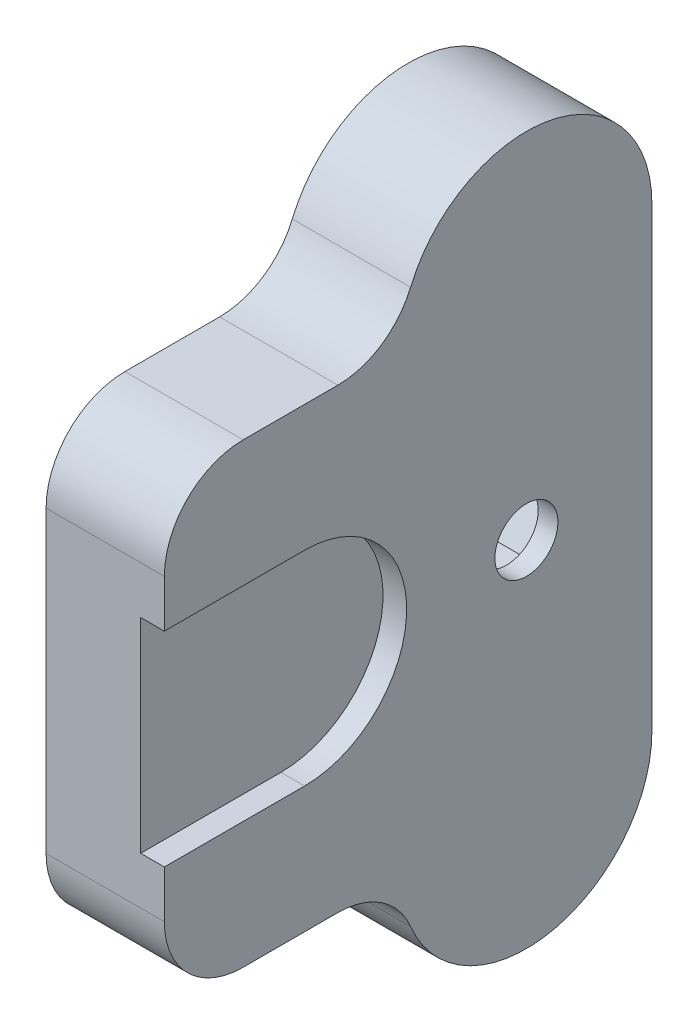
ISO-10303-21;
HEADER;
FILE_DESCRIPTION(('STEP AP214'),'2;1');
FILE_NAME('part.step','',(''),(''),'','','');
FILE_SCHEMA(('AUTOMOTIVE_DESIGN { 1 0 10303 214 1 1 1 1 }'));
ENDSEC;
DATA;
#1=APPLICATION_CONTEXT('core data for automotive mechanical design processes');
#2=APPLICATION_PROTOCOL_DEFINITION('international standard','automotive_design',2000,#1);
#3=PRODUCT_CONTEXT('',#1,'mechanical');
#4=PRODUCT('Part','Part','',(#3));
#5=PRODUCT_RELATED_PRODUCT_CATEGORY('part','',(#4));
#6=PRODUCT_DEFINITION_FORMATION('','',#4);
#7=PRODUCT_DEFINITION_CONTEXT('part definition',#1,'design');
#8=PRODUCT_DEFINITION('design','',#6,#7);
#9=PRODUCT_DEFINITION_SHAPE('','',#8);
#10=(LENGTH_UNIT() NAMED_UNIT(*) SI_UNIT(.MILLI.,.METRE.));
#11=(NAMED_UNIT(*) PLANE_ANGLE_UNIT() SI_UNIT($,.RADIAN.));
#12=(NAMED_UNIT(*) SI_UNIT($,.STERADIAN.) SOLID_ANGLE_UNIT());
#13=UNCERTAINTY_MEASURE_WITH_UNIT(LENGTH_MEASURE(1.E-05),#10,'distance_accuracy_value','');
#14=(GEOMETRIC_REPRESENTATION_CONTEXT(3) GLOBAL_UNCERTAINTY_ASSIGNED_CONTEXT((#13)) GLOBAL_UNIT_ASSIGNED_CONTEXT((#10,
#11,#12)) REPRESENTATION_CONTEXT('',''));
#15=CARTESIAN_POINT('',(0.,0.,0.));
#16=DIRECTION('',(0.,0.,1.));
#17=DIRECTION('',(1.,0.,0.));
#18=AXIS2_PLACEMENT_3D('',#15,#16,#17);
#19=CARTESIAN_POINT('',(15.,-28.9686177509747,3.13232637331732));
#20=DIRECTION('',(-1.,0.,0.));
#21=DIRECTION('',(0.,0.,1.));
#22=AXIS2_PLACEMENT_3D('',#19,#20,#21);
#23=CYLINDRICAL_SURFACE('',#22,15.921660548038);
#24=CARTESIAN_POINT('',(0.,-28.9686177509747,3.13232637331732));
#25=DIRECTION('',(1.,0.,0.));
#26=DIRECTION('',(0.,0.,-1.));
#27=AXIS2_PLACEMENT_3D('',#24,#25,#26);
#28=CIRCLE('',#27,15.921660548038);
#29=CARTESIAN_POINT('',(0.,-35.1108402056403,17.821518928538));
#30=VERTEX_POINT('',#29);
#31=CARTESIAN_POINT('',(0.,-28.9686177509747,-12.7893341747207));
#32=VERTEX_POINT('',#31);
#33=EDGE_CURVE('E254',#30,#32,#28,.T.);
#34=ORIENTED_EDGE('',*,*,#33,.T.);
#35=DIRECTION('',(-1.,0.,0.));
#36=VECTOR('',#35,1.);
#37=CARTESIAN_POINT('',(15.,-28.9686177509747,-12.7893341747207));
#38=LINE('',#37,#36);
#39=CARTESIAN_POINT('',(15.,-28.9686177509747,-12.7893341747207));
#40=VERTEX_POINT('',#39);
#41=EDGE_CURVE('E326',#40,#32,#38,.T.);
#42=ORIENTED_EDGE('',*,*,#41,.F.);
#43=CARTESIAN_POINT('',(15.,-28.9686177509747,3.13232637331732));
#44=DIRECTION('',(1.,0.,0.));
#45=DIRECTION('',(0.,0.,-1.));
#46=AXIS2_PLACEMENT_3D('',#43,#44,#45);
#47=CIRCLE('',#46,15.921660548038);
#48=CARTESIAN_POINT('',(15.,-35.1108402056403,17.821518928538));
#49=VERTEX_POINT('',#48);
#50=EDGE_CURVE('E258',#49,#40,#47,.T.);
#51=ORIENTED_EDGE('',*,*,#50,.F.);
#52=DIRECTION('',(-1.,0.,0.));
#53=VECTOR('',#52,1.);
#54=CARTESIAN_POINT('',(15.,-35.1108402056403,17.821518928538));
#55=LINE('',#54,#53);
#56=EDGE_CURVE('E278',#49,#30,#55,.T.);
#57=ORIENTED_EDGE('',*,*,#56,.T.);
#58=EDGE_LOOP('',(#34,#42,#51,#57));
#59=FACE_BOUND('',#58,.T.);
#60=ADVANCED_FACE('F46',(#59),#23,.T.);
#61=CARTESIAN_POINT('',(15.,-28.9686177509747,-12.7893341747207));
#62=DIRECTION('',(0.,0.,1.));
#63=DIRECTION('',(1.,0.,0.));
#64=AXIS2_PLACEMENT_3D('',#61,#62,#63);
#65=PLANE('',#64);
#66=DIRECTION('',(0.,1.,0.));
#67=VECTOR('',#66,1.);
#68=CARTESIAN_POINT('',(0.,-28.9686177509747,-12.7893341747207));
#69=LINE('',#68,#67);
#70=CARTESIAN_POINT('',(0.,28.9686177509747,-12.7893341747207));
#71=VERTEX_POINT('',#70);
#72=EDGE_CURVE('E284',#32,#71,#69,.T.);
#73=ORIENTED_EDGE('',*,*,#72,.T.);
#74=DIRECTION('',(-1.,0.,0.));
#75=VECTOR('',#74,1.);
#76=CARTESIAN_POINT('',(15.,28.9686177509747,-12.7893341747207));
#77=LINE('',#76,#75);
#78=CARTESIAN_POINT('',(15.,28.9686177509747,-12.7893341747207));
#79=VERTEX_POINT('',#78);
#80=EDGE_CURVE('E323',#79,#71,#77,.T.);
#81=ORIENTED_EDGE('',*,*,#80,.F.);
#82=DIRECTION('',(0.,1.,0.));
#83=VECTOR('',#82,1.);
#84=CARTESIAN_POINT('',(15.,-28.9686177509747,-12.7893341747207));
#85=LINE('',#84,#83);
#86=EDGE_CURVE('E259',#40,#79,#85,.T.);
#87=ORIENTED_EDGE('',*,*,#86,.F.);
#88=ORIENTED_EDGE('',*,*,#41,.T.);
#89=EDGE_LOOP('',(#73,#81,#87,#88));
#90=FACE_BOUND('',#89,.T.);
#91=ADVANCED_FACE('F364',(#90),#65,.F.);
#92=CARTESIAN_POINT('',(15.,28.9686177509747,3.13232637331732));
#93=DIRECTION('',(-1.,0.,0.));
#94=DIRECTION('',(0.,0.,1.));
#95=AXIS2_PLACEMENT_3D('',#92,#93,#94);
#96=CYLINDRICAL_SURFACE('',#95,15.921660548038);
#97=CARTESIAN_POINT('',(0.,28.9686177509747,3.13232637331732));
#98=DIRECTION('',(1.,0.,0.));
#99=DIRECTION('',(0.,0.,1.));
#100=AXIS2_PLACEMENT_3D('',#97,#98,#99);
#101=CIRCLE('',#100,15.921660548038);
#102=CARTESIAN_POINT('',(0.,35.1108402056403,17.821518928538));
#103=VERTEX_POINT('',#102);
#104=EDGE_CURVE('E285',#71,#103,#101,.T.);
#105=ORIENTED_EDGE('',*,*,#104,.T.);
#106=DIRECTION('',(-1.,0.,0.));
#107=VECTOR('',#106,1.);
#108=CARTESIAN_POINT('',(15.,35.1108402056403,17.821518928538));
#109=LINE('',#108,#107);
#110=CARTESIAN_POINT('',(15.,35.1108402056403,17.821518928538));
#111=VERTEX_POINT('',#110);
#112=EDGE_CURVE('E319',#111,#103,#109,.T.);
#113=ORIENTED_EDGE('',*,*,#112,.F.);
#114=CARTESIAN_POINT('',(15.,28.9686177509747,3.13232637331732));
#115=DIRECTION('',(1.,0.,0.));
#116=DIRECTION('',(0.,0.,1.));
#117=AXIS2_PLACEMENT_3D('',#114,#115,#116);
#118=CIRCLE('',#117,15.921660548038);
#119=EDGE_CURVE('E265',#79,#111,#118,.T.);
#120=ORIENTED_EDGE('',*,*,#119,.F.);
#121=ORIENTED_EDGE('',*,*,#80,.T.);
#122=EDGE_LOOP('',(#105,#113,#120,#121));
#123=FACE_BOUND('',#122,.T.);
#124=ADVANCED_FACE('F367',(#123),#96,.T.);
#125=CARTESIAN_POINT('',(15.,38.9686177509747,27.0474363577541));
#126=DIRECTION('',(-1.,0.,0.));
#127=DIRECTION('',(0.,0.,1.));
#128=AXIS2_PLACEMENT_3D('',#125,#126,#127);
#129=CYLINDRICAL_SURFACE('',#128,9.99999999999999);
#130=CARTESIAN_POINT('',(0.,38.9686177509747,27.0474363577541));
#131=DIRECTION('',(-1.,0.,0.));
#132=DIRECTION('',(0.,0.,1.));
#133=AXIS2_PLACEMENT_3D('',#130,#131,#132);
#134=CIRCLE('',#133,9.99999999999999);
#135=CARTESIAN_POINT('',(0.,28.9686177509747,27.0474363577541));
#136=VERTEX_POINT('',#135);
#137=EDGE_CURVE('E290',#103,#136,#134,.T.);
#138=ORIENTED_EDGE('',*,*,#137,.T.);
#139=DIRECTION('',(-1.,0.,0.));
#140=VECTOR('',#139,1.);
#141=CARTESIAN_POINT('',(15.,28.9686177509747,27.0474363577541));
#142=LINE('',#141,#140);
#143=CARTESIAN_POINT('',(15.,28.9686177509747,27.0474363577541));
#144=VERTEX_POINT('',#143);
#145=EDGE_CURVE('E320',#144,#136,#142,.T.);
#146=ORIENTED_EDGE('',*,*,#145,.F.);
#147=CARTESIAN_POINT('',(15.,38.9686177509747,27.0474363577541));
#148=DIRECTION('',(-1.,0.,0.));
#149=DIRECTION('',(0.,0.,1.));
#150=AXIS2_PLACEMENT_3D('',#147,#148,#149);
#151=CIRCLE('',#150,9.99999999999999);
#152=EDGE_CURVE('E262',#111,#144,#151,.T.);
#153=ORIENTED_EDGE('',*,*,#152,.F.);
#154=ORIENTED_EDGE('',*,*,#112,.T.);
#155=EDGE_LOOP('',(#138,#146,#153,#154));
#156=FACE_BOUND('',#155,.T.);
#157=ADVANCED_FACE('F416',(#156),#129,.F.);
#158=CARTESIAN_POINT('',(15.,28.9686177509747,39.0539869213552));
#159=DIRECTION('',(0.,-1.,0.));
#160=DIRECTION('',(0.,0.,-1.));
#161=AXIS2_PLACEMENT_3D('',#158,#159,#160);
#162=PLANE('',#161);
#163=DIRECTION('',(0.,0.,1.));
#164=VECTOR('',#163,1.);
#165=CARTESIAN_POINT('',(0.,28.9686177509747,39.0539869213552));
#166=LINE('',#165,#164);
#167=CARTESIAN_POINT('',(0.,28.9686177509747,39.0539869213552));
#168=VERTEX_POINT('',#167);
#169=EDGE_CURVE('E287',#136,#168,#166,.T.);
#170=ORIENTED_EDGE('',*,*,#169,.T.);
#171=DIRECTION('',(-1.,0.,0.));
#172=VECTOR('',#171,1.);
#173=CARTESIAN_POINT('',(15.,28.9686177509747,39.0539869213552));
#174=LINE('',#173,#172);
#175=CARTESIAN_POINT('',(15.,28.9686177509747,39.0539869213552));
#176=VERTEX_POINT('',#175);
#177=EDGE_CURVE('E314',#176,#168,#174,.T.);
#178=ORIENTED_EDGE('',*,*,#177,.F.);
#179=DIRECTION('',(0.,0.,1.));
#180=VECTOR('',#179,1.);
#181=CARTESIAN_POINT('',(15.,28.9686177509747,39.0539869213552));
#182=LINE('',#181,#180);
#183=EDGE_CURVE('E266',#144,#176,#182,.T.);
#184=ORIENTED_EDGE('',*,*,#183,.F.);
#185=ORIENTED_EDGE('',*,*,#145,.T.);
#186=EDGE_LOOP('',(#170,#178,#184,#185));
#187=FACE_BOUND('',#186,.T.);
#188=ADVANCED_FACE('F413',(#187),#162,.F.);
#189=CARTESIAN_POINT('',(15.,18.9686177509747,39.0539869213552));
#190=DIRECTION('',(-1.,0.,0.));
#191=DIRECTION('',(0.,0.,1.));
#192=AXIS2_PLACEMENT_3D('',#189,#190,#191);
#193=CYLINDRICAL_SURFACE('',#192,10.);
#194=CARTESIAN_POINT('',(0.,18.9686177509747,39.0539869213552));
#195=DIRECTION('',(1.,0.,0.));
#196=DIRECTION('',(0.,0.,1.));
#197=AXIS2_PLACEMENT_3D('',#194,#195,#196);
#198=CIRCLE('',#197,10.);
#199=CARTESIAN_POINT('',(0.,18.9686177509747,49.0539869213552));
#200=VERTEX_POINT('',#199);
#201=EDGE_CURVE('E292',#168,#200,#198,.T.);
#202=ORIENTED_EDGE('',*,*,#201,.T.);
#203=DIRECTION('',(-1.,0.,0.));
#204=VECTOR('',#203,1.);
#205=CARTESIAN_POINT('',(15.,18.9686177509747,49.0539869213552));
#206=LINE('',#205,#204);
#207=CARTESIAN_POINT('',(15.,18.9686177509747,49.0539869213552));
#208=VERTEX_POINT('',#207);
#209=EDGE_CURVE('E313',#208,#200,#206,.T.);
#210=ORIENTED_EDGE('',*,*,#209,.F.);
#211=CARTESIAN_POINT('',(15.,18.9686177509747,39.0539869213552));
#212=DIRECTION('',(1.,0.,0.));
#213=DIRECTION('',(0.,0.,1.));
#214=AXIS2_PLACEMENT_3D('',#211,#212,#213);
#215=CIRCLE('',#214,10.);
#216=EDGE_CURVE('E268',#176,#208,#215,.T.);
#217=ORIENTED_EDGE('',*,*,#216,.F.);
#218=ORIENTED_EDGE('',*,*,#177,.T.);
#219=EDGE_LOOP('',(#202,#210,#217,#218));
#220=FACE_BOUND('',#219,.T.);
#221=ADVANCED_FACE('F410',(#220),#193,.T.);
#222=CARTESIAN_POINT('',(15.,18.9686177509747,49.0539869213552));
#223=DIRECTION('',(0.,0.,-1.));
#224=DIRECTION('',(0.,1.,0.));
#225=AXIS2_PLACEMENT_3D('',#222,#223,#224);
#226=PLANE('',#225);
#227=DIRECTION('',(0.,-1.,0.));
#228=VECTOR('',#227,1.);
#229=CARTESIAN_POINT('',(12.,-12.95,49.0539869213552));
#230=LINE('',#229,#228);
#231=CARTESIAN_POINT('',(12.,12.95,49.0539869213552));
#232=VERTEX_POINT('',#231);
#233=CARTESIAN_POINT('',(12.,-12.95,49.0539869213552));
#234=VERTEX_POINT('',#233);
#235=EDGE_CURVE('E223',#232,#234,#230,.T.);
#236=ORIENTED_EDGE('',*,*,#235,.F.);
#237=DIRECTION('',(1.,0.,0.));
#238=VECTOR('',#237,1.);
#239=CARTESIAN_POINT('',(12.,12.95,49.0539869213552));
#240=LINE('',#239,#238);
#241=CARTESIAN_POINT('',(15.,12.95,49.0539869213552));
#242=VERTEX_POINT('',#241);
#243=EDGE_CURVE('E245',#232,#242,#240,.T.);
#244=ORIENTED_EDGE('',*,*,#243,.T.);
#245=DIRECTION('',(0.,-1.,0.));
#246=VECTOR('',#245,1.);
#247=CARTESIAN_POINT('',(15.,18.9686177509747,49.0539869213552));
#248=LINE('',#247,#246);
#249=EDGE_CURVE('E271',#208,#242,#248,.T.);
#250=ORIENTED_EDGE('',*,*,#249,.F.);
#251=ORIENTED_EDGE('',*,*,#209,.T.);
#252=DIRECTION('',(0.,-1.,0.));
#253=VECTOR('',#252,1.);
#254=CARTESIAN_POINT('',(0.,18.9686177509747,49.0539869213552));
#255=LINE('',#254,#253);
#256=CARTESIAN_POINT('',(0.,-18.9686177509747,49.0539869213552));
#257=VERTEX_POINT('',#256);
#258=EDGE_CURVE('E291',#200,#257,#255,.T.);
#259=ORIENTED_EDGE('',*,*,#258,.T.);
#260=DIRECTION('',(-1.,0.,0.));
#261=VECTOR('',#260,1.);
#262=CARTESIAN_POINT('',(15.,-18.9686177509747,49.0539869213552));
#263=LINE('',#262,#261);
#264=CARTESIAN_POINT('',(15.,-18.9686177509747,49.0539869213552));
#265=VERTEX_POINT('',#264);
#266=EDGE_CURVE('E306',#265,#257,#263,.T.);
#267=ORIENTED_EDGE('',*,*,#266,.F.);
#268=CARTESIAN_POINT('',(15.,-12.95,49.0539869213552));
#269=VERTEX_POINT('',#268);
#270=EDGE_CURVE('E269',#269,#265,#248,.T.);
#271=ORIENTED_EDGE('',*,*,#270,.F.);
#272=DIRECTION('',(1.,0.,0.));
#273=VECTOR('',#272,1.);
#274=CARTESIAN_POINT('',(12.,-12.95,49.0539869213552));
#275=LINE('',#274,#273);
#276=EDGE_CURVE('E68',#234,#269,#275,.T.);
#277=ORIENTED_EDGE('',*,*,#276,.F.);
#278=EDGE_LOOP('',(#236,#244,#250,#251,#259,#267,#271,#277));
#279=FACE_BOUND('',#278,.T.);
#280=ADVANCED_FACE('F404',(#279),#226,.F.);
#281=CARTESIAN_POINT('',(15.,-18.9686177509747,39.0539869213552));
#282=DIRECTION('',(-1.,0.,0.));
#283=DIRECTION('',(0.,0.,1.));
#284=AXIS2_PLACEMENT_3D('',#281,#282,#283);
#285=CYLINDRICAL_SURFACE('',#284,10.);
#286=CARTESIAN_POINT('',(0.,-18.9686177509747,39.0539869213552));
#287=DIRECTION('',(1.,0.,0.));
#288=DIRECTION('',(0.,0.,-1.));
#289=AXIS2_PLACEMENT_3D('',#286,#287,#288);
#290=CIRCLE('',#289,10.);
#291=CARTESIAN_POINT('',(0.,-28.9686177509747,39.0539869213552));
#292=VERTEX_POINT('',#291);
#293=EDGE_CURVE('E293',#257,#292,#290,.T.);
#294=ORIENTED_EDGE('',*,*,#293,.T.);
#295=DIRECTION('',(-1.,0.,0.));
#296=VECTOR('',#295,1.);
#297=CARTESIAN_POINT('',(15.,-28.9686177509747,39.0539869213552));
#298=LINE('',#297,#296);
#299=CARTESIAN_POINT('',(15.,-28.9686177509747,39.0539869213552));
#300=VERTEX_POINT('',#299);
#301=EDGE_CURVE('E301',#300,#292,#298,.T.);
#302=ORIENTED_EDGE('',*,*,#301,.F.);
#303=CARTESIAN_POINT('',(15.,-18.9686177509747,39.0539869213552));
#304=DIRECTION('',(1.,0.,0.));
#305=DIRECTION('',(0.,0.,-1.));
#306=AXIS2_PLACEMENT_3D('',#303,#304,#305);
#307=CIRCLE('',#306,10.);
#308=EDGE_CURVE('E273',#265,#300,#307,.T.);
#309=ORIENTED_EDGE('',*,*,#308,.F.);
#310=ORIENTED_EDGE('',*,*,#266,.T.);
#311=EDGE_LOOP('',(#294,#302,#309,#310));
#312=FACE_BOUND('',#311,.T.);
#313=ADVANCED_FACE('F398',(#312),#285,.T.);
#314=CARTESIAN_POINT('',(15.,-28.9686177509747,39.0539869213552));
#315=DIRECTION('',(0.,1.,0.));
#316=DIRECTION('',(0.,0.,1.));
#317=AXIS2_PLACEMENT_3D('',#314,#315,#316);
#318=PLANE('',#317);
#319=DIRECTION('',(0.,0.,-1.));
#320=VECTOR('',#319,1.);
#321=CARTESIAN_POINT('',(0.,-28.9686177509747,39.0539869213552));
#322=LINE('',#321,#320);
#323=CARTESIAN_POINT('',(0.,-28.9686177509747,27.0474363577541));
#324=VERTEX_POINT('',#323);
#325=EDGE_CURVE('E299',#292,#324,#322,.T.);
#326=ORIENTED_EDGE('',*,*,#325,.T.);
#327=DIRECTION('',(-1.,0.,0.));
#328=VECTOR('',#327,1.);
#329=CARTESIAN_POINT('',(15.,-28.9686177509747,27.0474363577541));
#330=LINE('',#329,#328);
#331=CARTESIAN_POINT('',(15.,-28.9686177509747,27.0474363577541));
#332=VERTEX_POINT('',#331);
#333=EDGE_CURVE('E305',#332,#324,#330,.T.);
#334=ORIENTED_EDGE('',*,*,#333,.F.);
#335=DIRECTION('',(0.,0.,-1.));
#336=VECTOR('',#335,1.);
#337=CARTESIAN_POINT('',(15.,-28.9686177509747,39.0539869213552));
#338=LINE('',#337,#336);
#339=EDGE_CURVE('E277',#300,#332,#338,.T.);
#340=ORIENTED_EDGE('',*,*,#339,.F.);
#341=ORIENTED_EDGE('',*,*,#301,.T.);
#342=EDGE_LOOP('',(#326,#334,#340,#341));
#343=FACE_BOUND('',#342,.T.);
#344=ADVANCED_FACE('F392',(#343),#318,.F.);
#345=CARTESIAN_POINT('',(15.,-38.9686177509747,27.0474363577541));
#346=DIRECTION('',(-1.,0.,0.));
#347=DIRECTION('',(0.,0.,1.));
#348=AXIS2_PLACEMENT_3D('',#345,#346,#347);
#349=CYLINDRICAL_SURFACE('',#348,9.99999999999999);
#350=CARTESIAN_POINT('',(0.,-38.9686177509747,27.0474363577541));
#351=DIRECTION('',(-1.,0.,0.));
#352=DIRECTION('',(0.,0.,-1.));
#353=AXIS2_PLACEMENT_3D('',#350,#351,#352);
#354=CIRCLE('',#353,9.99999999999999);
#355=EDGE_CURVE('E257',#324,#30,#354,.T.);
#356=ORIENTED_EDGE('',*,*,#355,.T.);
#357=ORIENTED_EDGE('',*,*,#56,.F.);
#358=CARTESIAN_POINT('',(15.,-38.9686177509747,27.0474363577541));
#359=DIRECTION('',(-1.,0.,0.));
#360=DIRECTION('',(0.,0.,-1.));
#361=AXIS2_PLACEMENT_3D('',#358,#359,#360);
#362=CIRCLE('',#361,9.99999999999999);
#363=EDGE_CURVE('E279',#332,#49,#362,.T.);
#364=ORIENTED_EDGE('',*,*,#363,.F.);
#365=ORIENTED_EDGE('',*,*,#333,.T.);
#366=EDGE_LOOP('',(#356,#357,#364,#365));
#367=FACE_BOUND('',#366,.T.);
#368=ADVANCED_FACE('F388',(#367),#349,.F.);
#369=CARTESIAN_POINT('',(15.,-28.9686177509747,3.13232637331732));
#370=DIRECTION('',(1.,0.,0.));
#371=DIRECTION('',(0.,0.,-1.));
#372=AXIS2_PLACEMENT_3D('',#369,#370,#371);
#373=PLANE('',#372);
#374=DIRECTION('',(0.,0.,1.));
#375=VECTOR('',#374,1.);
#376=CARTESIAN_POINT('',(15.,12.95,31.2677038838304));
#377=LINE('',#376,#375);
#378=CARTESIAN_POINT('',(15.,12.95,31.2677038838304));
#379=VERTEX_POINT('',#378);
#380=EDGE_CURVE('E228',#379,#242,#377,.T.);
#381=ORIENTED_EDGE('',*,*,#380,.F.);
#382=CARTESIAN_POINT('',(15.,0.,31.2677038838304));
#383=DIRECTION('',(1.,0.,0.));
#384=DIRECTION('',(0.,0.,-1.));
#385=AXIS2_PLACEMENT_3D('',#382,#383,#384);
#386=CIRCLE('',#385,12.95);
#387=CARTESIAN_POINT('',(15.,-12.95,31.2677038838304));
#388=VERTEX_POINT('',#387);
#389=EDGE_CURVE('E238',#388,#379,#386,.T.);
#390=ORIENTED_EDGE('',*,*,#389,.F.);
#391=DIRECTION('',(0.,0.,-1.));
#392=VECTOR('',#391,1.);
#393=CARTESIAN_POINT('',(15.,-12.95,49.0539869213552));
#394=LINE('',#393,#392);
#395=EDGE_CURVE('E236',#269,#388,#394,.T.);
#396=ORIENTED_EDGE('',*,*,#395,.F.);
#397=ORIENTED_EDGE('',*,*,#270,.T.);
#398=ORIENTED_EDGE('',*,*,#308,.T.);
#399=ORIENTED_EDGE('',*,*,#339,.T.);
#400=ORIENTED_EDGE('',*,*,#363,.T.);
#401=ORIENTED_EDGE('',*,*,#50,.T.);
#402=ORIENTED_EDGE('',*,*,#86,.T.);
#403=ORIENTED_EDGE('',*,*,#119,.T.);
#404=ORIENTED_EDGE('',*,*,#152,.T.);
#405=ORIENTED_EDGE('',*,*,#183,.T.);
#406=ORIENTED_EDGE('',*,*,#216,.T.);
#407=ORIENTED_EDGE('',*,*,#249,.T.);
#408=EDGE_LOOP('',(#381,#390,#396,#397,#398,#399,#400,#401,#402,#403,#404,#405,#406,#407));
#409=FACE_BOUND('',#408,.T.);
#410=CARTESIAN_POINT('',(15.,0.,3.13232637331727));
#411=DIRECTION('',(1.,0.,0.));
#412=DIRECTION('',(0.,0.,-1.));
#413=AXIS2_PLACEMENT_3D('',#410,#411,#412);
#414=CIRCLE('',#413,4.);
#415=CARTESIAN_POINT('',(15.,0.,-0.867673626682733));
#416=VERTEX_POINT('',#415);
#417=EDGE_CURVE('E250',#416,#416,#414,.T.);
#418=ORIENTED_EDGE('',*,*,#417,.F.);
#419=EDGE_LOOP('',(#418));
#420=FACE_BOUND('',#419,.T.);
#421=ADVANCED_FACE('F383',(#409,#420),#373,.T.);
#422=CARTESIAN_POINT('',(0.,-28.9686177509747,3.13232637331732));
#423=DIRECTION('',(1.,0.,0.));
#424=DIRECTION('',(0.,0.,-1.));
#425=AXIS2_PLACEMENT_3D('',#422,#423,#424);
#426=PLANE('',#425);
#427=DIRECTION('',(0.,0.845327020739453,0.534249219005289));
#428=VECTOR('',#427,1.);
#429=CARTESIAN_POINT('',(0.,-17.7085347037566,-14.684175957385));
#430=LINE('',#429,#428);
#431=CARTESIAN_POINT('',(0.,0.258716841757371,-3.32881895310315));
#432=VERTEX_POINT('',#431);
#433=CARTESIAN_POINT('',(0.,5.72487441110187,0.125809067455821));
#434=VERTEX_POINT('',#433);
#435=EDGE_CURVE('E52',#432,#434,#430,.T.);
#436=ORIENTED_EDGE('',*,*,#435,.T.);
#437=DIRECTION('',(0.,-0.040009885240851,0.999199283968426));
#438=VECTOR('',#437,1.);
#439=CARTESIAN_POINT('',(0.,5.54914329004977,4.51448474770838));
#440=LINE('',#439,#438);
#441=CARTESIAN_POINT('',(0.,5.4661575693445,6.58695439387624));
#442=VERTEX_POINT('',#441);
#443=EDGE_CURVE('E11',#434,#442,#440,.T.);
#444=ORIENTED_EDGE('',*,*,#443,.T.);
#445=DIRECTION('',(0.,-0.885336905980303,0.464950064963136));
#446=VECTOR('',#445,1.);
#447=CARTESIAN_POINT('',(0.,-20.1025032323088,20.014781044326));
#448=LINE('',#447,#446);
#449=CARTESIAN_POINT('',(0.,-0.258716841757364,9.59347169973769));
#450=VERTEX_POINT('',#449);
#451=EDGE_CURVE('E188',#442,#450,#448,.T.);
#452=ORIENTED_EDGE('',*,*,#451,.T.);
#453=DIRECTION('',(0.,-0.845327020739452,-0.53424921900529));
#454=VECTOR('',#453,1.);
#455=CARTESIAN_POINT('',(0.,-23.6921259566159,-5.21651332510313));
#456=LINE('',#455,#454);
#457=CARTESIAN_POINT('',(0.,-5.72487441110187,6.13884367917871));
#458=VERTEX_POINT('',#457);
#459=EDGE_CURVE('E335',#450,#458,#456,.T.);
#460=ORIENTED_EDGE('',*,*,#459,.T.);
#461=DIRECTION('',(0.,0.0400098852408509,-0.999199283968426));
#462=VECTOR('',#461,1.);
#463=CARTESIAN_POINT('',(0.,-5.64188869039658,4.06637403301085));
#464=LINE('',#463,#462);
#465=CARTESIAN_POINT('',(0.,-5.46615756934448,-0.322301647241716));
#466=VERTEX_POINT('',#465);
#467=EDGE_CURVE('E333',#458,#466,#464,.T.);
#468=ORIENTED_EDGE('',*,*,#467,.T.);
#469=DIRECTION('',(0.,0.885336905980303,-0.464950064963136));
#470=VECTOR('',#469,1.);
#471=CARTESIAN_POINT('',(0.,-25.3099439598959,10.0990076973466));
#472=LINE('',#471,#470);
#473=EDGE_CURVE('E339',#466,#432,#472,.T.);
#474=ORIENTED_EDGE('',*,*,#473,.T.);
#475=EDGE_LOOP('',(#436,#444,#452,#460,#468,#474));
#476=FACE_BOUND('',#475,.T.);
#477=ORIENTED_EDGE('',*,*,#33,.F.);
#478=ORIENTED_EDGE('',*,*,#355,.F.);
#479=ORIENTED_EDGE('',*,*,#325,.F.);
#480=ORIENTED_EDGE('',*,*,#293,.F.);
#481=ORIENTED_EDGE('',*,*,#258,.F.);
#482=ORIENTED_EDGE('',*,*,#201,.F.);
#483=ORIENTED_EDGE('',*,*,#169,.F.);
#484=ORIENTED_EDGE('',*,*,#137,.F.);
#485=ORIENTED_EDGE('',*,*,#104,.F.);
#486=ORIENTED_EDGE('',*,*,#72,.F.);
#487=EDGE_LOOP('',(#477,#478,#479,#480,#481,#482,#483,#484,#485,#486));
#488=FACE_BOUND('',#487,.T.);
#489=ADVANCED_FACE('F345',(#476,#488),#426,.F.);
#490=CARTESIAN_POINT('',(0.953799999999999,0.,3.13232637331727));
#491=DIRECTION('',(1.,0.,0.));
#492=DIRECTION('',(0.,0.,-1.));
#493=AXIS2_PLACEMENT_3D('',#490,#491,#492);
#494=CYLINDRICAL_SURFACE('',#493,4.);
#495=CARTESIAN_POINT('',(12.5,0.,3.13232637331727));
#496=DIRECTION('',(1.,0.,0.));
#497=DIRECTION('',(0.,0.,-1.));
#498=AXIS2_PLACEMENT_3D('',#495,#496,#497);
#499=CIRCLE('',#498,4.);
#500=CARTESIAN_POINT('',(12.5,0.,-0.867673626682733));
#501=VERTEX_POINT('',#500);
#502=EDGE_CURVE('E220',#501,#501,#499,.F.);
#503=CARTESIAN_POINT('',(12.5,0.,-0.867673626682733));
#504=CARTESIAN_POINT('',(12.5260416666667,0.,-0.867673626682733));
#505=CARTESIAN_POINT('',(12.5520833333333,0.,-0.867673626682733));
#506=CARTESIAN_POINT('',(12.6041666666667,0.,-0.867673626682733));
#507=CARTESIAN_POINT('',(12.6302083333333,0.,-0.867673626682733));
#508=CARTESIAN_POINT('',(12.6822916666667,0.,-0.867673626682733));
#509=CARTESIAN_POINT('',(12.7083333333333,0.,-0.867673626682733));
#510=CARTESIAN_POINT('',(12.7604166666667,0.,-0.867673626682733));
#511=CARTESIAN_POINT('',(12.7864583333333,0.,-0.867673626682733));
#512=CARTESIAN_POINT('',(12.8385416666667,0.,-0.867673626682733));
#513=CARTESIAN_POINT('',(12.8645833333333,0.,-0.867673626682733));
#514=CARTESIAN_POINT('',(12.9166666666667,0.,-0.867673626682733));
#515=CARTESIAN_POINT('',(12.9427083333333,0.,-0.867673626682733));
#516=CARTESIAN_POINT('',(12.9947916666667,0.,-0.867673626682733));
#517=CARTESIAN_POINT('',(13.0208333333333,0.,-0.867673626682733));
#518=CARTESIAN_POINT('',(13.0729166666667,0.,-0.867673626682733));
#519=CARTESIAN_POINT('',(13.0989583333333,0.,-0.867673626682733));
#520=CARTESIAN_POINT('',(13.1510416666667,0.,-0.867673626682733));
#521=CARTESIAN_POINT('',(13.1770833333333,0.,-0.867673626682733));
#522=CARTESIAN_POINT('',(13.2291666666667,0.,-0.867673626682733));
#523=CARTESIAN_POINT('',(13.2552083333333,0.,-0.867673626682733));
#524=CARTESIAN_POINT('',(13.3072916666667,0.,-0.867673626682733));
#525=CARTESIAN_POINT('',(13.3333333333333,0.,-0.867673626682733));
#526=CARTESIAN_POINT('',(13.3854166666667,0.,-0.867673626682733));
#527=CARTESIAN_POINT('',(13.4114583333333,0.,-0.867673626682733));
#528=CARTESIAN_POINT('',(13.4635416666667,0.,-0.867673626682733));
#529=CARTESIAN_POINT('',(13.4895833333333,0.,-0.867673626682733));
#530=CARTESIAN_POINT('',(13.5416666666667,0.,-0.867673626682733));
#531=CARTESIAN_POINT('',(13.5677083333333,0.,-0.867673626682733));
#532=CARTESIAN_POINT('',(13.6197916666667,0.,-0.867673626682733));
#533=CARTESIAN_POINT('',(13.6458333333333,0.,-0.867673626682733));
#534=CARTESIAN_POINT('',(13.6979166666667,0.,-0.867673626682733));
#535=CARTESIAN_POINT('',(13.7239583333333,0.,-0.867673626682733));
#536=CARTESIAN_POINT('',(13.7760416666667,0.,-0.867673626682733));
#537=CARTESIAN_POINT('',(13.8020833333333,0.,-0.867673626682733));
#538=CARTESIAN_POINT('',(13.8541666666667,0.,-0.867673626682733));
#539=CARTESIAN_POINT('',(13.8802083333333,0.,-0.867673626682733));
#540=CARTESIAN_POINT('',(13.9322916666667,0.,-0.867673626682733));
#541=CARTESIAN_POINT('',(13.9583333333333,0.,-0.867673626682733));
#542=CARTESIAN_POINT('',(14.0104166666667,0.,-0.867673626682733));
#543=CARTESIAN_POINT('',(14.0364583333333,0.,-0.867673626682733));
#544=CARTESIAN_POINT('',(14.0885416666667,0.,-0.867673626682733));
#545=CARTESIAN_POINT('',(14.1145833333333,0.,-0.867673626682733));
#546=CARTESIAN_POINT('',(14.1666666666667,0.,-0.867673626682733));
#547=CARTESIAN_POINT('',(14.1927083333333,0.,-0.867673626682733));
#548=CARTESIAN_POINT('',(14.2447916666667,0.,-0.867673626682733));
#549=CARTESIAN_POINT('',(14.2708333333333,0.,-0.867673626682733));
#550=CARTESIAN_POINT('',(14.3229166666667,0.,-0.867673626682733));
#551=CARTESIAN_POINT('',(14.3489583333333,0.,-0.867673626682733));
#552=CARTESIAN_POINT('',(14.4010416666667,0.,-0.867673626682733));
#553=CARTESIAN_POINT('',(14.4270833333333,0.,-0.867673626682733));
#554=CARTESIAN_POINT('',(14.4791666666667,0.,-0.867673626682733));
#555=CARTESIAN_POINT('',(14.5052083333333,0.,-0.867673626682733));
#556=CARTESIAN_POINT('',(14.5572916666667,0.,-0.867673626682733));
#557=CARTESIAN_POINT('',(14.5833333333333,0.,-0.867673626682733));
#558=CARTESIAN_POINT('',(14.6354166666667,0.,-0.867673626682733));
#559=CARTESIAN_POINT('',(14.6614583333333,0.,-0.867673626682733));
#560=CARTESIAN_POINT('',(14.7135416666667,0.,-0.867673626682733));
#561=CARTESIAN_POINT('',(14.7395833333333,0.,-0.867673626682733));
#562=CARTESIAN_POINT('',(14.7916666666667,0.,-0.867673626682733));
#563=CARTESIAN_POINT('',(14.8177083333333,0.,-0.867673626682733));
#564=CARTESIAN_POINT('',(14.8697916666667,0.,-0.867673626682733));
#565=CARTESIAN_POINT('',(14.8958333333333,0.,-0.867673626682733));
#566=CARTESIAN_POINT('',(14.9479166666667,0.,-0.867673626682733));
#567=CARTESIAN_POINT('',(14.9739583333333,0.,-0.867673626682733));
#568=CARTESIAN_POINT('',(15.,0.,-0.867673626682733));
#569=B_SPLINE_CURVE_WITH_KNOTS('',3,(#503,#504,#505,#506,#507,#508,#509,#510,#511,#512,#513,
#514,#515,#516,#517,#518,#519,#520,#521,#522,#523,#524,#525,#526,#527,#528,#529,#530,#531,#532,
#533,#534,#535,#536,#537,#538,#539,#540,#541,#542,#543,#544,#545,#546,#547,#548,#549,#550,#551,
#552,#553,#554,#555,#556,#557,#558,#559,#560,#561,#562,#563,#564,#565,#566,#567,#568),
.UNSPECIFIED.,.F.,.F.,(4,2,2,2,2,2,2,2,2,2,2,2,2,2,2,2,2,2,2,2,2,2,2,2,2,2,2,2,2,2,2,2,4),(0.,
0.0781250000000001,0.15625,0.234375,0.3125,0.390625,0.46875,0.546875,0.625000000000001,
0.703124999999999,0.781249999999999,0.859374999999999,0.937499999999999,1.015625,1.09375,
1.171875,1.25,1.328125,1.40625,1.484375,1.5625,1.640625,1.71875,1.796875,1.875,1.953125,2.03125,
2.109375,2.1875,2.265625,2.34375,2.421875,2.5),.UNSPECIFIED.);
#570=EDGE_CURVE('BSEAM442',#501,#416,#569,.T.);
#571=ORIENTED_EDGE('',*,*,#502,.T.);
#572=ORIENTED_EDGE('',*,*,#417,.T.);
#573=ORIENTED_EDGE('',*,*,#570,.T.);
#574=ORIENTED_EDGE('',*,*,#570,.F.);
#575=EDGE_LOOP('',(#571,#573,#572,#574));
#576=FACE_BOUND('',#575,.T.);
#577=ADVANCED_FACE('F442',(#576),#494,.F.);
#578=CARTESIAN_POINT('',(12.,12.95,31.2677038838304));
#579=DIRECTION('',(0.,1.,0.));
#580=DIRECTION('',(0.,0.,1.));
#581=AXIS2_PLACEMENT_3D('',#578,#579,#580);
#582=PLANE('',#581);
#583=ORIENTED_EDGE('',*,*,#380,.T.);
#584=ORIENTED_EDGE('',*,*,#243,.F.);
#585=DIRECTION('',(0.,0.,1.));
#586=VECTOR('',#585,1.);
#587=CARTESIAN_POINT('',(12.,12.95,31.2677038838304));
#588=LINE('',#587,#586);
#589=CARTESIAN_POINT('',(12.,12.95,31.2677038838304));
#590=VERTEX_POINT('',#589);
#591=EDGE_CURVE('E234',#590,#232,#588,.T.);
#592=ORIENTED_EDGE('',*,*,#591,.F.);
#593=DIRECTION('',(1.,0.,0.));
#594=VECTOR('',#593,1.);
#595=CARTESIAN_POINT('',(12.,12.95,31.2677038838304));
#596=LINE('',#595,#594);
#597=EDGE_CURVE('E248',#590,#379,#596,.T.);
#598=ORIENTED_EDGE('',*,*,#597,.T.);
#599=EDGE_LOOP('',(#583,#584,#592,#598));
#600=FACE_BOUND('',#599,.T.);
#601=ADVANCED_FACE('F421',(#600),#582,.F.);
#602=CARTESIAN_POINT('',(12.,0.,31.2677038838304));
#603=DIRECTION('',(1.,0.,0.));
#604=DIRECTION('',(0.,0.,-1.));
#605=AXIS2_PLACEMENT_3D('',#602,#603,#604);
#606=CYLINDRICAL_SURFACE('',#605,12.95);
#607=ORIENTED_EDGE('',*,*,#389,.T.);
#608=ORIENTED_EDGE('',*,*,#597,.F.);
#609=CARTESIAN_POINT('',(12.,0.,31.2677038838304));
#610=DIRECTION('',(1.,0.,0.));
#611=DIRECTION('',(0.,0.,-1.));
#612=AXIS2_PLACEMENT_3D('',#609,#610,#611);
#613=CIRCLE('',#612,12.95);
#614=CARTESIAN_POINT('',(12.,-12.95,31.2677038838304));
#615=VERTEX_POINT('',#614);
#616=EDGE_CURVE('E235',#615,#590,#613,.T.);
#617=ORIENTED_EDGE('',*,*,#616,.F.);
#618=DIRECTION('',(1.,0.,0.));
#619=VECTOR('',#618,1.);
#620=CARTESIAN_POINT('',(12.,-12.95,31.2677038838304));
#621=LINE('',#620,#619);
#622=EDGE_CURVE('E246',#615,#388,#621,.T.);
#623=ORIENTED_EDGE('',*,*,#622,.T.);
#624=EDGE_LOOP('',(#607,#608,#617,#623));
#625=FACE_BOUND('',#624,.T.);
#626=ADVANCED_FACE('F427',(#625),#606,.F.);
#627=CARTESIAN_POINT('',(12.,-12.95,49.0539869213552));
#628=DIRECTION('',(0.,-1.,0.));
#629=DIRECTION('',(0.,0.,-1.));
#630=AXIS2_PLACEMENT_3D('',#627,#628,#629);
#631=PLANE('',#630);
#632=ORIENTED_EDGE('',*,*,#395,.T.);
#633=ORIENTED_EDGE('',*,*,#622,.F.);
#634=DIRECTION('',(0.,0.,-1.));
#635=VECTOR('',#634,1.);
#636=CARTESIAN_POINT('',(12.,-12.95,49.0539869213552));
#637=LINE('',#636,#635);
#638=EDGE_CURVE('E229',#234,#615,#637,.T.);
#639=ORIENTED_EDGE('',*,*,#638,.F.);
#640=ORIENTED_EDGE('',*,*,#276,.T.);
#641=EDGE_LOOP('',(#632,#633,#639,#640));
#642=FACE_BOUND('',#641,.T.);
#643=ADVANCED_FACE('F429',(#642),#631,.F.);
#644=CARTESIAN_POINT('',(12.,0.,31.2677038838304));
#645=DIRECTION('',(1.,0.,0.));
#646=DIRECTION('',(0.,0.,-1.));
#647=AXIS2_PLACEMENT_3D('',#644,#645,#646);
#648=PLANE('',#647);
#649=ORIENTED_EDGE('',*,*,#235,.T.);
#650=ORIENTED_EDGE('',*,*,#638,.T.);
#651=ORIENTED_EDGE('',*,*,#616,.T.);
#652=ORIENTED_EDGE('',*,*,#591,.T.);
#653=EDGE_LOOP('',(#649,#650,#651,#652));
#654=FACE_BOUND('',#653,.T.);
#655=ADVANCED_FACE('F426',(#654),#648,.T.);
#656=CARTESIAN_POINT('',(-12.5,5.54914329004977,4.51448474770838));
#657=DIRECTION('',(0.,0.999199283968425,0.040009885240851));
#658=DIRECTION('',(0.,-0.040009885240851,0.999199283968426));
#659=AXIS2_PLACEMENT_3D('',#656,#657,#658);
#660=PLANE('',#659);
#661=DIRECTION('',(1.,0.,0.));
#662=VECTOR('',#661,1.);
#663=CARTESIAN_POINT('',(-12.5,5.72487441110187,0.125809067455821));
#664=LINE('',#663,#662);
#665=CARTESIAN_POINT('',(12.5,5.72487441110187,0.125809067455821));
#666=VERTEX_POINT('',#665);
#667=EDGE_CURVE('E202',#434,#666,#664,.T.);
#668=ORIENTED_EDGE('',*,*,#667,.T.);
#669=DIRECTION('',(0.,-0.040009885240851,0.999199283968426));
#670=VECTOR('',#669,1.);
#671=CARTESIAN_POINT('',(12.5,5.54914329004977,4.51448474770838));
#672=LINE('',#671,#670);
#673=CARTESIAN_POINT('',(12.5,5.4661575693445,6.58695439387624));
#674=VERTEX_POINT('',#673);
#675=EDGE_CURVE('E197',#666,#674,#672,.T.);
#676=ORIENTED_EDGE('',*,*,#675,.T.);
#677=DIRECTION('',(1.,0.,0.));
#678=VECTOR('',#677,1.);
#679=CARTESIAN_POINT('',(-12.5,5.4661575693445,6.58695439387624));
#680=LINE('',#679,#678);
#681=EDGE_CURVE('E182',#442,#674,#680,.T.);
#682=ORIENTED_EDGE('',*,*,#681,.F.);
#683=ORIENTED_EDGE('',*,*,#443,.F.);
#684=EDGE_LOOP('',(#668,#676,#682,#683));
#685=FACE_BOUND('',#684,.T.);
#686=ADVANCED_FACE('F201',(#685),#660,.F.);
#687=CARTESIAN_POINT('',(-12.5,-17.7085347037566,-14.684175957385));
#688=DIRECTION('',(0.,0.534249219005289,-0.845327020739453));
#689=DIRECTION('',(0.,0.845327020739453,0.534249219005289));
#690=AXIS2_PLACEMENT_3D('',#687,#688,#689);
#691=PLANE('',#690);
#692=DIRECTION('',(1.,0.,0.));
#693=VECTOR('',#692,1.);
#694=CARTESIAN_POINT('',(-12.5,0.258716841757371,-3.32881895310315));
#695=LINE('',#694,#693);
#696=CARTESIAN_POINT('',(12.5,0.258716841757371,-3.32881895310315));
#697=VERTEX_POINT('',#696);
#698=EDGE_CURVE('E217',#432,#697,#695,.T.);
#699=ORIENTED_EDGE('',*,*,#698,.T.);
#700=DIRECTION('',(0.,0.845327020739452,0.534249219005289));
#701=VECTOR('',#700,1.);
#702=CARTESIAN_POINT('',(12.5,-17.7085347037566,-14.684175957385));
#703=LINE('',#702,#701);
#704=EDGE_CURVE('E190',#697,#666,#703,.T.);
#705=ORIENTED_EDGE('',*,*,#704,.T.);
#706=ORIENTED_EDGE('',*,*,#667,.F.);
#707=ORIENTED_EDGE('',*,*,#435,.F.);
#708=EDGE_LOOP('',(#699,#705,#706,#707));
#709=FACE_BOUND('',#708,.T.);
#710=ADVANCED_FACE('F347',(#709),#691,.F.);
#711=CARTESIAN_POINT('',(-12.5,-25.3099439598959,10.0990076973466));
#712=DIRECTION('',(0.,-0.464950064963136,-0.885336905980303));
#713=DIRECTION('',(0.,0.885336905980303,-0.464950064963136));
#714=AXIS2_PLACEMENT_3D('',#711,#712,#713);
#715=PLANE('',#714);
#716=DIRECTION('',(1.,0.,0.));
#717=VECTOR('',#716,1.);
#718=CARTESIAN_POINT('',(-12.5,-5.46615756934448,-0.322301647241716));
#719=LINE('',#718,#717);
#720=CARTESIAN_POINT('',(12.5,-5.46615756934448,-0.322301647241716));
#721=VERTEX_POINT('',#720);
#722=EDGE_CURVE('E219',#466,#721,#719,.T.);
#723=ORIENTED_EDGE('',*,*,#722,.T.);
#724=DIRECTION('',(0.,0.885336905980303,-0.464950064963136));
#725=VECTOR('',#724,1.);
#726=CARTESIAN_POINT('',(12.5,-25.3099439598959,10.0990076973466));
#727=LINE('',#726,#725);
#728=EDGE_CURVE('E215',#721,#697,#727,.T.);
#729=ORIENTED_EDGE('',*,*,#728,.T.);
#730=ORIENTED_EDGE('',*,*,#698,.F.);
#731=ORIENTED_EDGE('',*,*,#473,.F.);
#732=EDGE_LOOP('',(#723,#729,#730,#731));
#733=FACE_BOUND('',#732,.T.);
#734=ADVANCED_FACE('F346',(#733),#715,.F.);
#735=CARTESIAN_POINT('',(-12.5,-5.64188869039658,4.06637403301084));
#736=DIRECTION('',(0.,-0.999199283968425,-0.0400098852408509));
#737=DIRECTION('',(0.,0.0400098852408509,-0.999199283968426));
#738=AXIS2_PLACEMENT_3D('',#735,#736,#737);
#739=PLANE('',#738);
#740=DIRECTION('',(1.,0.,0.));
#741=VECTOR('',#740,1.);
#742=CARTESIAN_POINT('',(-12.5,-5.72487441110187,6.13884367917871));
#743=LINE('',#742,#741);
#744=CARTESIAN_POINT('',(12.5,-5.72487441110187,6.13884367917871));
#745=VERTEX_POINT('',#744);
#746=EDGE_CURVE('E225',#458,#745,#743,.T.);
#747=ORIENTED_EDGE('',*,*,#746,.T.);
#748=DIRECTION('',(0.,0.0400098852408509,-0.999199283968426));
#749=VECTOR('',#748,1.);
#750=CARTESIAN_POINT('',(12.5,-5.64188869039658,4.06637403301084));
#751=LINE('',#750,#749);
#752=EDGE_CURVE('E207',#745,#721,#751,.T.);
#753=ORIENTED_EDGE('',*,*,#752,.T.);
#754=ORIENTED_EDGE('',*,*,#722,.F.);
#755=ORIENTED_EDGE('',*,*,#467,.F.);
#756=EDGE_LOOP('',(#747,#753,#754,#755));
#757=FACE_BOUND('',#756,.T.);
#758=ADVANCED_FACE('F354',(#757),#739,.F.);
#759=CARTESIAN_POINT('',(-12.5,-23.6921259566159,-5.21651332510313));
#760=DIRECTION('',(0.,-0.53424921900529,0.845327020739452));
#761=DIRECTION('',(0.,-0.845327020739452,-0.53424921900529));
#762=AXIS2_PLACEMENT_3D('',#759,#760,#761);
#763=PLANE('',#762);
#764=DIRECTION('',(1.,0.,0.));
#765=VECTOR('',#764,1.);
#766=CARTESIAN_POINT('',(-12.5,-0.258716841757364,9.59347169973769));
#767=LINE('',#766,#765);
#768=CARTESIAN_POINT('',(12.5,-0.258716841757364,9.59347169973769));
#769=VERTEX_POINT('',#768);
#770=EDGE_CURVE('E58',#450,#769,#767,.T.);
#771=ORIENTED_EDGE('',*,*,#770,.T.);
#772=DIRECTION('',(0.,-0.845327020739452,-0.53424921900529));
#773=VECTOR('',#772,1.);
#774=CARTESIAN_POINT('',(12.5,-23.6921259566159,-5.21651332510313));
#775=LINE('',#774,#773);
#776=EDGE_CURVE('E203',#769,#745,#775,.T.);
#777=ORIENTED_EDGE('',*,*,#776,.T.);
#778=ORIENTED_EDGE('',*,*,#746,.F.);
#779=ORIENTED_EDGE('',*,*,#459,.F.);
#780=EDGE_LOOP('',(#771,#777,#778,#779));
#781=FACE_BOUND('',#780,.T.);
#782=ADVANCED_FACE('F351',(#781),#763,.F.);
#783=CARTESIAN_POINT('',(-12.5,-20.1025032323088,20.014781044326));
#784=DIRECTION('',(0.,0.464950064963136,0.885336905980303));
#785=DIRECTION('',(0.,-0.885336905980303,0.464950064963136));
#786=AXIS2_PLACEMENT_3D('',#783,#784,#785);
#787=PLANE('',#786);
#788=ORIENTED_EDGE('',*,*,#681,.T.);
#789=DIRECTION('',(0.,-0.885336905980303,0.464950064963136));
#790=VECTOR('',#789,1.);
#791=CARTESIAN_POINT('',(12.5,-20.1025032323088,20.014781044326));
#792=LINE('',#791,#790);
#793=EDGE_CURVE('E184',#674,#769,#792,.T.);
#794=ORIENTED_EDGE('',*,*,#793,.T.);
#795=ORIENTED_EDGE('',*,*,#770,.F.);
#796=ORIENTED_EDGE('',*,*,#451,.F.);
#797=EDGE_LOOP('',(#788,#794,#795,#796));
#798=FACE_BOUND('',#797,.T.);
#799=ADVANCED_FACE('F181',(#798),#787,.F.);
#800=CARTESIAN_POINT('',(12.5,0.,0.));
#801=DIRECTION('',(1.,0.,0.));
#802=DIRECTION('',(0.,0.,-1.));
#803=AXIS2_PLACEMENT_3D('',#800,#801,#802);
#804=PLANE('',#803);
#805=ORIENTED_EDGE('',*,*,#675,.F.);
#806=ORIENTED_EDGE('',*,*,#704,.F.);
#807=ORIENTED_EDGE('',*,*,#728,.F.);
#808=ORIENTED_EDGE('',*,*,#752,.F.);
#809=ORIENTED_EDGE('',*,*,#776,.F.);
#810=ORIENTED_EDGE('',*,*,#793,.F.);
#811=EDGE_LOOP('',(#805,#806,#807,#808,#809,#810));
#812=FACE_BOUND('',#811,.T.);
#813=ORIENTED_EDGE('',*,*,#502,.F.);
#814=EDGE_LOOP('',(#813));
#815=FACE_BOUND('',#814,.T.);
#816=ADVANCED_FACE('F194',(#812,#815),#804,.F.);
#817=CLOSED_SHELL('',(#60,#91,#124,#157,#188,#221,#280,#313,#344,#368,#421,#489,#577,#601,#626,
#643,#655,#686,#710,#734,#758,#782,#799,#816));
#818=MANIFOLD_SOLID_BREP('B2',#817);
#819=ADVANCED_BREP_SHAPE_REPRESENTATION('',(#18,#818),#14);
#820=SHAPE_DEFINITION_REPRESENTATION(#9,#819);
ENDSEC;
END-ISO-10303-21;
